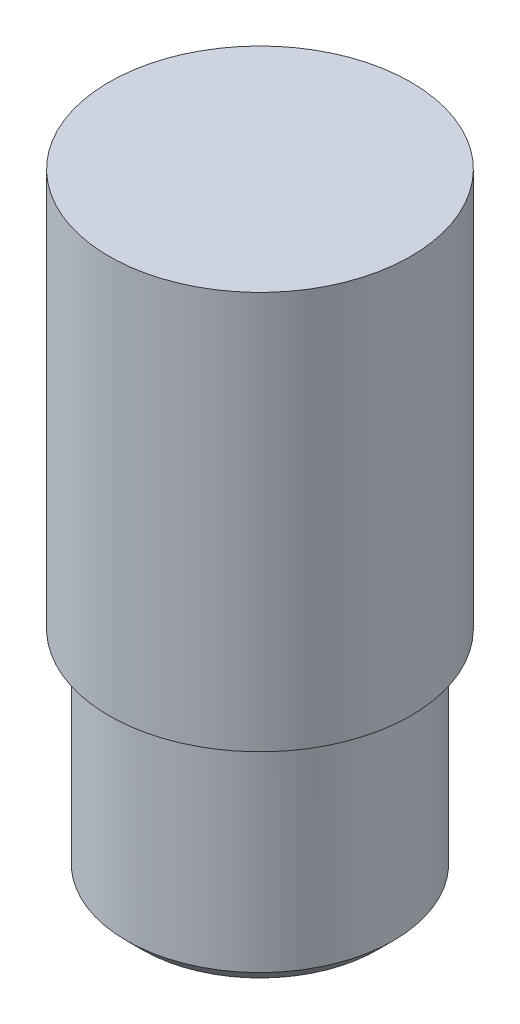
ISO-10303-21;
HEADER;
FILE_DESCRIPTION(('STEP AP214'),'2;1');
FILE_NAME('part.step','',(''),(''),'','','');
FILE_SCHEMA(('AUTOMOTIVE_DESIGN { 1 0 10303 214 1 1 1 1 }'));
ENDSEC;
DATA;
#1=APPLICATION_CONTEXT('core data for automotive mechanical design processes');
#2=APPLICATION_PROTOCOL_DEFINITION('international standard','automotive_design',2000,#1);
#3=PRODUCT_CONTEXT('',#1,'mechanical');
#4=PRODUCT('Part','Part','',(#3));
#5=PRODUCT_RELATED_PRODUCT_CATEGORY('part','',(#4));
#6=PRODUCT_DEFINITION_FORMATION('','',#4);
#7=PRODUCT_DEFINITION_CONTEXT('part definition',#1,'design');
#8=PRODUCT_DEFINITION('design','',#6,#7);
#9=PRODUCT_DEFINITION_SHAPE('','',#8);
#10=(LENGTH_UNIT() NAMED_UNIT(*) SI_UNIT(.MILLI.,.METRE.));
#11=(NAMED_UNIT(*) PLANE_ANGLE_UNIT() SI_UNIT($,.RADIAN.));
#12=(NAMED_UNIT(*) SI_UNIT($,.STERADIAN.) SOLID_ANGLE_UNIT());
#13=UNCERTAINTY_MEASURE_WITH_UNIT(LENGTH_MEASURE(1.E-05),#10,'distance_accuracy_value','');
#14=(GEOMETRIC_REPRESENTATION_CONTEXT(3) GLOBAL_UNCERTAINTY_ASSIGNED_CONTEXT((#13)) GLOBAL_UNIT_ASSIGNED_CONTEXT((#10,
#11,#12)) REPRESENTATION_CONTEXT('',''));
#15=CARTESIAN_POINT('',(0.,0.,0.));
#16=DIRECTION('',(0.,0.,1.));
#17=DIRECTION('',(1.,0.,0.));
#18=AXIS2_PLACEMENT_3D('',#15,#16,#17);
#19=CARTESIAN_POINT('',(-5.5,18.5,5.56600210823247));
#20=DIRECTION('',(0.,1.,0.));
#21=DIRECTION('',(1.,0.,0.));
#22=AXIS2_PLACEMENT_3D('',#19,#20,#21);
#23=PLANE('',#22);
#24=CARTESIAN_POINT('',(0.,18.5,0.));
#25=DIRECTION('',(0.,-1.,0.));
#26=DIRECTION('',(0.,0.,-1.));
#27=AXIS2_PLACEMENT_3D('',#24,#25,#26);
#28=CIRCLE('',#27,5.5);
#29=CARTESIAN_POINT('',(0.,18.5,-5.5));
#30=VERTEX_POINT('',#29);
#31=EDGE_CURVE('E17',#30,#30,#28,.T.);
#32=ORIENTED_EDGE('',*,*,#31,.F.);
#33=EDGE_LOOP('',(#32));
#34=FACE_BOUND('',#33,.T.);
#35=ADVANCED_FACE('F14',(#34),#23,.T.);
#36=CARTESIAN_POINT('',(0.,4.,0.));
#37=DIRECTION('',(0.,-1.,0.));
#38=DIRECTION('',(0.,0.,-1.));
#39=AXIS2_PLACEMENT_3D('',#36,#37,#38);
#40=CYLINDRICAL_SURFACE('',#39,5.5);
#41=CARTESIAN_POINT('',(0.,4.,0.));
#42=DIRECTION('',(0.,-1.,0.));
#43=DIRECTION('',(0.,0.,-1.));
#44=AXIS2_PLACEMENT_3D('',#41,#42,#43);
#45=CIRCLE('',#44,5.5);
#46=CARTESIAN_POINT('',(0.,4.,-5.5));
#47=VERTEX_POINT('',#46);
#48=EDGE_CURVE('E30',#47,#47,#45,.T.);
#49=ORIENTED_EDGE('',*,*,#48,.F.);
#50=EDGE_LOOP('',(#49));
#51=FACE_BOUND('',#50,.T.);
#52=ORIENTED_EDGE('',*,*,#31,.T.);
#53=EDGE_LOOP('',(#52));
#54=FACE_BOUND('',#53,.T.);
#55=ADVANCED_FACE('F37',(#51,#54),#40,.T.);
#56=CARTESIAN_POINT('',(5.5,4.,5.56600210822802));
#57=DIRECTION('',(0.,-1.,0.));
#58=DIRECTION('',(-1.,0.,0.));
#59=AXIS2_PLACEMENT_3D('',#56,#57,#58);
#60=PLANE('',#59);
#61=CARTESIAN_POINT('',(0.,4.,0.));
#62=DIRECTION('',(0.,-1.,0.));
#63=DIRECTION('',(0.,0.,-1.));
#64=AXIS2_PLACEMENT_3D('',#61,#62,#63);
#65=CIRCLE('',#64,4.864);
#66=CARTESIAN_POINT('',(0.,4.,-4.864));
#67=VERTEX_POINT('',#66);
#68=EDGE_CURVE('E26',#67,#67,#65,.T.);
#69=ORIENTED_EDGE('',*,*,#68,.F.);
#70=EDGE_LOOP('',(#69));
#71=FACE_BOUND('',#70,.T.);
#72=ORIENTED_EDGE('',*,*,#48,.T.);
#73=EDGE_LOOP('',(#72));
#74=FACE_BOUND('',#73,.T.);
#75=ADVANCED_FACE('F44',(#71,#74),#60,.T.);
#76=CARTESIAN_POINT('',(0.,-3.419,0.));
#77=DIRECTION('',(0.,-1.,0.));
#78=DIRECTION('',(0.,0.,-1.));
#79=AXIS2_PLACEMENT_3D('',#76,#77,#78);
#80=CYLINDRICAL_SURFACE('',#79,4.864);
#81=ORIENTED_EDGE('',*,*,#68,.T.);
#82=EDGE_LOOP('',(#81));
#83=FACE_BOUND('',#82,.T.);
#84=CARTESIAN_POINT('',(0.,-3.419,0.));
#85=DIRECTION('',(0.,-1.,0.));
#86=DIRECTION('',(-1.,0.,0.));
#87=AXIS2_PLACEMENT_3D('',#84,#85,#86);
#88=CIRCLE('',#87,4.864);
#89=CARTESIAN_POINT('',(-4.864,-3.419,0.));
#90=VERTEX_POINT('',#89);
#91=EDGE_CURVE('E21',#90,#90,#88,.T.);
#92=ORIENTED_EDGE('',*,*,#91,.F.);
#93=EDGE_LOOP('',(#92));
#94=FACE_BOUND('',#93,.T.);
#95=ADVANCED_FACE('F53',(#83,#94),#80,.T.);
#96=CARTESIAN_POINT('',(4.283,-4.,4.33439810820662));
#97=DIRECTION('',(0.,-1.,0.));
#98=DIRECTION('',(-1.,0.,0.));
#99=AXIS2_PLACEMENT_3D('',#96,#97,#98);
#100=PLANE('',#99);
#101=CARTESIAN_POINT('',(0.,-4.,0.));
#102=DIRECTION('',(0.,1.,0.));
#103=DIRECTION('',(0.,0.,1.));
#104=AXIS2_PLACEMENT_3D('',#101,#102,#103);
#105=CIRCLE('',#104,4.283);
#106=CARTESIAN_POINT('',(0.,-4.,4.283));
#107=VERTEX_POINT('',#106);
#108=EDGE_CURVE('E10',#107,#107,#105,.T.);
#109=ORIENTED_EDGE('',*,*,#108,.F.);
#110=EDGE_LOOP('',(#109));
#111=FACE_BOUND('',#110,.T.);
#112=ADVANCED_FACE('F48',(#111),#100,.T.);
#113=CARTESIAN_POINT('',(0.,-4.,0.));
#114=DIRECTION('',(0.,1.,0.));
#115=DIRECTION('',(0.,0.,1.));
#116=AXIS2_PLACEMENT_3D('',#113,#114,#115);
#117=CONICAL_SURFACE('',#116,4.283,0.785398163397447);
#118=ORIENTED_EDGE('',*,*,#108,.T.);
#119=EDGE_LOOP('',(#118));
#120=FACE_BOUND('',#119,.T.);
#121=ORIENTED_EDGE('',*,*,#91,.T.);
#122=EDGE_LOOP('',(#121));
#123=FACE_BOUND('',#122,.T.);
#124=ADVANCED_FACE('F46',(#120,#123),#117,.T.);
#125=CLOSED_SHELL('',(#35,#55,#75,#95,#112,#124));
#126=MANIFOLD_SOLID_BREP('B1',#125);
#127=ADVANCED_BREP_SHAPE_REPRESENTATION('',(#18,#126),#14);
#128=SHAPE_DEFINITION_REPRESENTATION(#9,#127);
ENDSEC;
END-ISO-10303-21;
